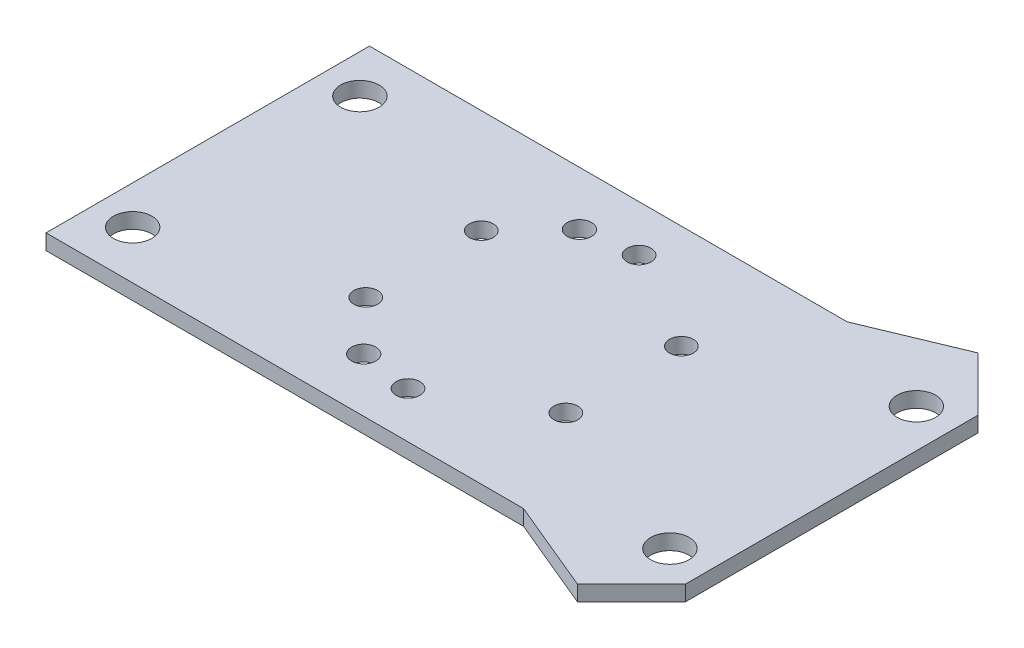
ISO-10303-21;
HEADER;
FILE_DESCRIPTION(('STEP AP214'),'2;1');
FILE_NAME('part.step','',(''),(''),'','','');
FILE_SCHEMA(('AUTOMOTIVE_DESIGN { 1 0 10303 214 1 1 1 1 }'));
ENDSEC;
DATA;
#1=APPLICATION_CONTEXT('core data for automotive mechanical design processes');
#2=APPLICATION_PROTOCOL_DEFINITION('international standard','automotive_design',2000,#1);
#3=PRODUCT_CONTEXT('',#1,'mechanical');
#4=PRODUCT('Part','Part','',(#3));
#5=PRODUCT_RELATED_PRODUCT_CATEGORY('part','',(#4));
#6=PRODUCT_DEFINITION_FORMATION('','',#4);
#7=PRODUCT_DEFINITION_CONTEXT('part definition',#1,'design');
#8=PRODUCT_DEFINITION('design','',#6,#7);
#9=PRODUCT_DEFINITION_SHAPE('','',#8);
#10=(LENGTH_UNIT() NAMED_UNIT(*) SI_UNIT(.MILLI.,.METRE.));
#11=(NAMED_UNIT(*) PLANE_ANGLE_UNIT() SI_UNIT($,.RADIAN.));
#12=(NAMED_UNIT(*) SI_UNIT($,.STERADIAN.) SOLID_ANGLE_UNIT());
#13=UNCERTAINTY_MEASURE_WITH_UNIT(LENGTH_MEASURE(1.E-05),#10,'distance_accuracy_value','');
#14=(GEOMETRIC_REPRESENTATION_CONTEXT(3) GLOBAL_UNCERTAINTY_ASSIGNED_CONTEXT((#13)) GLOBAL_UNIT_ASSIGNED_CONTEXT((#10,
#11,#12)) REPRESENTATION_CONTEXT('',''));
#15=CARTESIAN_POINT('',(0.,0.,0.));
#16=DIRECTION('',(0.,0.,1.));
#17=DIRECTION('',(1.,0.,0.));
#18=AXIS2_PLACEMENT_3D('',#15,#16,#17);
#19=CARTESIAN_POINT('',(0.,5.,-21.));
#20=DIRECTION('',(0.,0.,-1.));
#21=DIRECTION('',(-1.,0.,0.));
#22=AXIS2_PLACEMENT_3D('',#19,#20,#21);
#23=PLANE('',#22);
#24=DIRECTION('',(1.,0.,0.));
#25=VECTOR('',#24,1.);
#26=CARTESIAN_POINT('',(0.,0.,-21.));
#27=LINE('',#26,#25);
#28=CARTESIAN_POINT('',(-41.,0.,-21.));
#29=VERTEX_POINT('',#28);
#30=CARTESIAN_POINT('',(21.,0.,-21.));
#31=VERTEX_POINT('',#30);
#32=EDGE_CURVE('E11',#29,#31,#27,.T.);
#33=ORIENTED_EDGE('',*,*,#32,.T.);
#34=DIRECTION('',(0.,1.,0.));
#35=VECTOR('',#34,1.);
#36=CARTESIAN_POINT('',(21.,-2.,-21.));
#37=LINE('',#36,#35);
#38=CARTESIAN_POINT('',(21.,-2.,-21.));
#39=VERTEX_POINT('',#38);
#40=EDGE_CURVE('E136',#39,#31,#37,.T.);
#41=ORIENTED_EDGE('',*,*,#40,.F.);
#42=DIRECTION('',(1.,0.,0.));
#43=VECTOR('',#42,1.);
#44=CARTESIAN_POINT('',(0.,-2.,-21.));
#45=LINE('',#44,#43);
#46=CARTESIAN_POINT('',(-41.,-2.,-21.));
#47=VERTEX_POINT('',#46);
#48=EDGE_CURVE('E195',#47,#39,#45,.T.);
#49=ORIENTED_EDGE('',*,*,#48,.F.);
#50=DIRECTION('',(0.,1.,0.));
#51=VECTOR('',#50,1.);
#52=CARTESIAN_POINT('',(-41.,-2.,-21.));
#53=LINE('',#52,#51);
#54=EDGE_CURVE('E153',#47,#29,#53,.T.);
#55=ORIENTED_EDGE('',*,*,#54,.T.);
#56=EDGE_LOOP('',(#33,#41,#49,#55));
#57=FACE_BOUND('',#56,.T.);
#58=ADVANCED_FACE('F44',(#57),#23,.T.);
#59=CARTESIAN_POINT('',(0.,0.,21.));
#60=DIRECTION('',(0.,0.,1.));
#61=DIRECTION('',(1.,0.,0.));
#62=AXIS2_PLACEMENT_3D('',#59,#60,#61);
#63=PLANE('',#62);
#64=DIRECTION('',(0.,1.,0.));
#65=VECTOR('',#64,1.);
#66=CARTESIAN_POINT('',(21.,-2.,21.));
#67=LINE('',#66,#65);
#68=CARTESIAN_POINT('',(21.,-2.,21.));
#69=VERTEX_POINT('',#68);
#70=CARTESIAN_POINT('',(21.,0.,21.));
#71=VERTEX_POINT('',#70);
#72=EDGE_CURVE('E133',#69,#71,#67,.T.);
#73=ORIENTED_EDGE('',*,*,#72,.T.);
#74=DIRECTION('',(-1.,0.,0.));
#75=VECTOR('',#74,1.);
#76=CARTESIAN_POINT('',(0.,0.,21.));
#77=LINE('',#76,#75);
#78=CARTESIAN_POINT('',(-41.,0.,21.));
#79=VERTEX_POINT('',#78);
#80=EDGE_CURVE('E54',#71,#79,#77,.T.);
#81=ORIENTED_EDGE('',*,*,#80,.T.);
#82=DIRECTION('',(0.,1.,0.));
#83=VECTOR('',#82,1.);
#84=CARTESIAN_POINT('',(-41.,-2.,21.));
#85=LINE('',#84,#83);
#86=CARTESIAN_POINT('',(-41.,-2.,21.));
#87=VERTEX_POINT('',#86);
#88=EDGE_CURVE('E138',#87,#79,#85,.T.);
#89=ORIENTED_EDGE('',*,*,#88,.F.);
#90=DIRECTION('',(-1.,0.,0.));
#91=VECTOR('',#90,1.);
#92=CARTESIAN_POINT('',(0.,-2.,21.));
#93=LINE('',#92,#91);
#94=EDGE_CURVE('E160',#69,#87,#93,.T.);
#95=ORIENTED_EDGE('',*,*,#94,.F.);
#96=EDGE_LOOP('',(#73,#81,#89,#95));
#97=FACE_BOUND('',#96,.T.);
#98=ADVANCED_FACE('F46',(#97),#63,.T.);
#99=CARTESIAN_POINT('',(40.,5.,0.));
#100=DIRECTION('',(-1.,0.,0.));
#101=DIRECTION('',(0.,0.,1.));
#102=AXIS2_PLACEMENT_3D('',#99,#100,#101);
#103=PLANE('',#102);
#104=DIRECTION('',(0.,1.,0.));
#105=VECTOR('',#104,1.);
#106=CARTESIAN_POINT('',(40.,7.9,-19.));
#107=LINE('',#106,#105);
#108=CARTESIAN_POINT('',(40.,-2.,-19.));
#109=VERTEX_POINT('',#108);
#110=CARTESIAN_POINT('',(40.,0.,-19.));
#111=VERTEX_POINT('',#110);
#112=EDGE_CURVE('E48',#109,#111,#107,.T.);
#113=ORIENTED_EDGE('',*,*,#112,.T.);
#114=DIRECTION('',(0.,0.,1.));
#115=VECTOR('',#114,1.);
#116=CARTESIAN_POINT('',(40.,0.,0.));
#117=LINE('',#116,#115);
#118=CARTESIAN_POINT('',(40.,0.,19.));
#119=VERTEX_POINT('',#118);
#120=EDGE_CURVE('E127',#111,#119,#117,.T.);
#121=ORIENTED_EDGE('',*,*,#120,.T.);
#122=DIRECTION('',(0.,-1.,0.));
#123=VECTOR('',#122,1.);
#124=CARTESIAN_POINT('',(40.,5.,19.));
#125=LINE('',#124,#123);
#126=CARTESIAN_POINT('',(40.,-2.,19.));
#127=VERTEX_POINT('',#126);
#128=EDGE_CURVE('E126',#119,#127,#125,.T.);
#129=ORIENTED_EDGE('',*,*,#128,.T.);
#130=DIRECTION('',(0.,0.,1.));
#131=VECTOR('',#130,1.);
#132=CARTESIAN_POINT('',(40.,-2.,0.));
#133=LINE('',#132,#131);
#134=EDGE_CURVE('E203',#109,#127,#133,.T.);
#135=ORIENTED_EDGE('',*,*,#134,.F.);
#136=EDGE_LOOP('',(#113,#121,#129,#135));
#137=FACE_BOUND('',#136,.T.);
#138=ADVANCED_FACE('F207',(#137),#103,.F.);
#139=CARTESIAN_POINT('',(35.,5.,-16.));
#140=DIRECTION('',(0.,-1.,0.));
#141=DIRECTION('',(0.,0.,-1.));
#142=AXIS2_PLACEMENT_3D('',#139,#140,#141);
#143=CYLINDRICAL_SURFACE('',#142,2.5);
#144=CARTESIAN_POINT('',(35.,0.,-16.));
#145=DIRECTION('',(0.,-1.,0.));
#146=DIRECTION('',(0.,0.,-1.));
#147=AXIS2_PLACEMENT_3D('',#144,#145,#146);
#148=CIRCLE('',#147,2.5);
#149=CARTESIAN_POINT('',(35.,0.,-18.5));
#150=VERTEX_POINT('',#149);
#151=EDGE_CURVE('E167',#150,#150,#148,.T.);
#152=ORIENTED_EDGE('',*,*,#151,.F.);
#153=EDGE_LOOP('',(#152));
#154=FACE_BOUND('',#153,.T.);
#155=CARTESIAN_POINT('',(35.,-2.,-16.));
#156=DIRECTION('',(0.,-1.,0.));
#157=DIRECTION('',(0.,0.,-1.));
#158=AXIS2_PLACEMENT_3D('',#155,#156,#157);
#159=CIRCLE('',#158,2.5);
#160=CARTESIAN_POINT('',(35.,-2.,-18.5));
#161=VERTEX_POINT('',#160);
#162=EDGE_CURVE('E192',#161,#161,#159,.F.);
#163=ORIENTED_EDGE('',*,*,#162,.F.);
#164=EDGE_LOOP('',(#163));
#165=FACE_BOUND('',#164,.T.);
#166=ADVANCED_FACE('F209',(#154,#165),#143,.F.);
#167=CARTESIAN_POINT('',(-36.,5.,-14.75));
#168=DIRECTION('',(0.,-1.,0.));
#169=DIRECTION('',(0.,0.,-1.));
#170=AXIS2_PLACEMENT_3D('',#167,#168,#169);
#171=CYLINDRICAL_SURFACE('',#170,2.5);
#172=CARTESIAN_POINT('',(-36.,0.,-14.75));
#173=DIRECTION('',(0.,-1.,0.));
#174=DIRECTION('',(0.,0.,-1.));
#175=AXIS2_PLACEMENT_3D('',#172,#173,#174);
#176=CIRCLE('',#175,2.5);
#177=CARTESIAN_POINT('',(-36.,0.,-17.25));
#178=VERTEX_POINT('',#177);
#179=EDGE_CURVE('E170',#178,#178,#176,.T.);
#180=ORIENTED_EDGE('',*,*,#179,.F.);
#181=EDGE_LOOP('',(#180));
#182=FACE_BOUND('',#181,.T.);
#183=CARTESIAN_POINT('',(-36.,-2.,-14.75));
#184=DIRECTION('',(0.,-1.,0.));
#185=DIRECTION('',(0.,0.,-1.));
#186=AXIS2_PLACEMENT_3D('',#183,#184,#185);
#187=CIRCLE('',#186,2.5);
#188=CARTESIAN_POINT('',(-36.,-2.,-17.25));
#189=VERTEX_POINT('',#188);
#190=EDGE_CURVE('E180',#189,#189,#187,.F.);
#191=ORIENTED_EDGE('',*,*,#190,.F.);
#192=EDGE_LOOP('',(#191));
#193=FACE_BOUND('',#192,.T.);
#194=ADVANCED_FACE('F215',(#182,#193),#171,.F.);
#195=CARTESIAN_POINT('',(-36.,5.,14.75));
#196=DIRECTION('',(0.,-1.,0.));
#197=DIRECTION('',(0.,0.,-1.));
#198=AXIS2_PLACEMENT_3D('',#195,#196,#197);
#199=CYLINDRICAL_SURFACE('',#198,2.5);
#200=CARTESIAN_POINT('',(-36.,0.,14.75));
#201=DIRECTION('',(0.,-1.,0.));
#202=DIRECTION('',(0.,0.,-1.));
#203=AXIS2_PLACEMENT_3D('',#200,#201,#202);
#204=CIRCLE('',#203,2.5);
#205=CARTESIAN_POINT('',(-36.,0.,12.25));
#206=VERTEX_POINT('',#205);
#207=EDGE_CURVE('E174',#206,#206,#204,.T.);
#208=ORIENTED_EDGE('',*,*,#207,.F.);
#209=EDGE_LOOP('',(#208));
#210=FACE_BOUND('',#209,.T.);
#211=CARTESIAN_POINT('',(-36.,-2.,14.75));
#212=DIRECTION('',(0.,-1.,0.));
#213=DIRECTION('',(0.,0.,-1.));
#214=AXIS2_PLACEMENT_3D('',#211,#212,#213);
#215=CIRCLE('',#214,2.5);
#216=CARTESIAN_POINT('',(-36.,-2.,12.25));
#217=VERTEX_POINT('',#216);
#218=EDGE_CURVE('E189',#217,#217,#215,.F.);
#219=ORIENTED_EDGE('',*,*,#218,.F.);
#220=EDGE_LOOP('',(#219));
#221=FACE_BOUND('',#220,.T.);
#222=ADVANCED_FACE('F228',(#210,#221),#199,.F.);
#223=CARTESIAN_POINT('',(-41.,5.,0.));
#224=DIRECTION('',(-1.,0.,0.));
#225=DIRECTION('',(0.,0.,1.));
#226=AXIS2_PLACEMENT_3D('',#223,#224,#225);
#227=PLANE('',#226);
#228=DIRECTION('',(0.,0.,1.));
#229=VECTOR('',#228,1.);
#230=CARTESIAN_POINT('',(-41.,0.,0.));
#231=LINE('',#230,#229);
#232=EDGE_CURVE('E158',#29,#79,#231,.T.);
#233=ORIENTED_EDGE('',*,*,#232,.F.);
#234=ORIENTED_EDGE('',*,*,#54,.F.);
#235=DIRECTION('',(0.,0.,-1.));
#236=VECTOR('',#235,1.);
#237=CARTESIAN_POINT('',(-41.,-2.,0.));
#238=LINE('',#237,#236);
#239=EDGE_CURVE('E62',#87,#47,#238,.T.);
#240=ORIENTED_EDGE('',*,*,#239,.F.);
#241=ORIENTED_EDGE('',*,*,#88,.T.);
#242=EDGE_LOOP('',(#233,#234,#240,#241));
#243=FACE_BOUND('',#242,.T.);
#244=ADVANCED_FACE('F157',(#243),#227,.T.);
#245=CARTESIAN_POINT('',(35.,5.,16.));
#246=DIRECTION('',(0.,-1.,0.));
#247=DIRECTION('',(0.,0.,-1.));
#248=AXIS2_PLACEMENT_3D('',#245,#246,#247);
#249=CYLINDRICAL_SURFACE('',#248,2.5);
#250=CARTESIAN_POINT('',(35.,0.,16.));
#251=DIRECTION('',(0.,-1.,0.));
#252=DIRECTION('',(0.,0.,-1.));
#253=AXIS2_PLACEMENT_3D('',#250,#251,#252);
#254=CIRCLE('',#253,2.5);
#255=CARTESIAN_POINT('',(35.,0.,13.5));
#256=VERTEX_POINT('',#255);
#257=EDGE_CURVE('E324',#256,#256,#254,.T.);
#258=ORIENTED_EDGE('',*,*,#257,.F.);
#259=EDGE_LOOP('',(#258));
#260=FACE_BOUND('',#259,.T.);
#261=CARTESIAN_POINT('',(35.,-2.,16.));
#262=DIRECTION('',(0.,-1.,0.));
#263=DIRECTION('',(0.,0.,-1.));
#264=AXIS2_PLACEMENT_3D('',#261,#262,#263);
#265=CIRCLE('',#264,2.5);
#266=CARTESIAN_POINT('',(35.,-2.,13.5));
#267=VERTEX_POINT('',#266);
#268=EDGE_CURVE('E116',#267,#267,#265,.F.);
#269=ORIENTED_EDGE('',*,*,#268,.F.);
#270=EDGE_LOOP('',(#269));
#271=FACE_BOUND('',#270,.T.);
#272=ADVANCED_FACE('F227',(#260,#271),#249,.F.);
#273=CARTESIAN_POINT('',(-6.74999999999993,0.,14.));
#274=DIRECTION('',(0.,1.,0.));
#275=DIRECTION('',(0.,0.,1.));
#276=AXIS2_PLACEMENT_3D('',#273,#274,#275);
#277=CYLINDRICAL_SURFACE('',#276,1.57499999999999);
#278=CARTESIAN_POINT('',(-6.74999999999993,0.,14.));
#279=DIRECTION('',(0.,-1.,0.));
#280=DIRECTION('',(0.,0.,-1.));
#281=AXIS2_PLACEMENT_3D('',#278,#279,#280);
#282=CIRCLE('',#281,1.57499999999999);
#283=CARTESIAN_POINT('',(-6.74999999999993,0.,12.425));
#284=VERTEX_POINT('',#283);
#285=EDGE_CURVE('E332',#284,#284,#282,.T.);
#286=ORIENTED_EDGE('',*,*,#285,.F.);
#287=EDGE_LOOP('',(#286));
#288=FACE_BOUND('',#287,.T.);
#289=CARTESIAN_POINT('',(-6.74999999999993,-2.,14.));
#290=DIRECTION('',(0.,-1.,0.));
#291=DIRECTION('',(0.,0.,-1.));
#292=AXIS2_PLACEMENT_3D('',#289,#290,#291);
#293=CIRCLE('',#292,1.57499999999999);
#294=CARTESIAN_POINT('',(-6.74999999999993,-2.,12.425));
#295=VERTEX_POINT('',#294);
#296=EDGE_CURVE('E183',#295,#295,#293,.F.);
#297=ORIENTED_EDGE('',*,*,#296,.F.);
#298=EDGE_LOOP('',(#297));
#299=FACE_BOUND('',#298,.T.);
#300=ADVANCED_FACE('F237',(#288,#299),#277,.F.);
#301=CARTESIAN_POINT('',(-6.74999999999993,0.,-14.));
#302=DIRECTION('',(0.,1.,0.));
#303=DIRECTION('',(0.,0.,1.));
#304=AXIS2_PLACEMENT_3D('',#301,#302,#303);
#305=CYLINDRICAL_SURFACE('',#304,1.57499999999999);
#306=CARTESIAN_POINT('',(-6.74999999999993,0.,-14.));
#307=DIRECTION('',(0.,-1.,0.));
#308=DIRECTION('',(0.,0.,-1.));
#309=AXIS2_PLACEMENT_3D('',#306,#307,#308);
#310=CIRCLE('',#309,1.57499999999999);
#311=CARTESIAN_POINT('',(-6.74999999999993,0.,-15.575));
#312=VERTEX_POINT('',#311);
#313=EDGE_CURVE('E329',#312,#312,#310,.F.);
#314=ORIENTED_EDGE('',*,*,#313,.T.);
#315=EDGE_LOOP('',(#314));
#316=FACE_BOUND('',#315,.T.);
#317=CARTESIAN_POINT('',(-6.74999999999993,-2.,-14.));
#318=DIRECTION('',(0.,-1.,0.));
#319=DIRECTION('',(0.,0.,-1.));
#320=AXIS2_PLACEMENT_3D('',#317,#318,#319);
#321=CIRCLE('',#320,1.57499999999999);
#322=CARTESIAN_POINT('',(-6.74999999999993,-2.,-15.575));
#323=VERTEX_POINT('',#322);
#324=EDGE_CURVE('E186',#323,#323,#321,.F.);
#325=ORIENTED_EDGE('',*,*,#324,.F.);
#326=EDGE_LOOP('',(#325));
#327=FACE_BOUND('',#326,.T.);
#328=ADVANCED_FACE('F241',(#316,#327),#305,.F.);
#329=CARTESIAN_POINT('',(38.,5.,-21.));
#330=DIRECTION('',(0.707106781186547,0.,-0.707106781186547));
#331=DIRECTION('',(0.,1.,0.));
#332=AXIS2_PLACEMENT_3D('',#329,#330,#331);
#333=PLANE('',#332);
#334=DIRECTION('',(-0.707106781186548,0.,-0.707106781186548));
#335=VECTOR('',#334,1.);
#336=CARTESIAN_POINT('',(38.,0.,-21.));
#337=LINE('',#336,#335);
#338=CARTESIAN_POINT('',(33.,0.,-26.));
#339=VERTEX_POINT('',#338);
#340=EDGE_CURVE('E327',#111,#339,#337,.T.);
#341=ORIENTED_EDGE('',*,*,#340,.F.);
#342=ORIENTED_EDGE('',*,*,#112,.F.);
#343=DIRECTION('',(0.707106781186548,0.,0.707106781186548));
#344=VECTOR('',#343,1.);
#345=CARTESIAN_POINT('',(29.5,-2.,-29.5));
#346=LINE('',#345,#344);
#347=CARTESIAN_POINT('',(33.,-2.,-26.));
#348=VERTEX_POINT('',#347);
#349=EDGE_CURVE('E200',#348,#109,#346,.T.);
#350=ORIENTED_EDGE('',*,*,#349,.F.);
#351=DIRECTION('',(0.,1.,0.));
#352=VECTOR('',#351,1.);
#353=CARTESIAN_POINT('',(33.,-2.,-26.));
#354=LINE('',#353,#352);
#355=EDGE_CURVE('E132',#348,#339,#354,.T.);
#356=ORIENTED_EDGE('',*,*,#355,.T.);
#357=EDGE_LOOP('',(#341,#342,#350,#356));
#358=FACE_BOUND('',#357,.T.);
#359=ADVANCED_FACE('F245',(#358),#333,.T.);
#360=CARTESIAN_POINT('',(40.,5.,19.));
#361=DIRECTION('',(-0.707106781186549,0.,-0.707106781186546));
#362=DIRECTION('',(0.,-1.,0.));
#363=AXIS2_PLACEMENT_3D('',#360,#361,#362);
#364=PLANE('',#363);
#365=DIRECTION('',(-0.707106781186546,0.,0.707106781186549));
#366=VECTOR('',#365,1.);
#367=CARTESIAN_POINT('',(40.,0.,19.));
#368=LINE('',#367,#366);
#369=CARTESIAN_POINT('',(33.,0.,26.));
#370=VERTEX_POINT('',#369);
#371=EDGE_CURVE('E109',#370,#119,#368,.F.);
#372=ORIENTED_EDGE('',*,*,#371,.F.);
#373=DIRECTION('',(0.,1.,0.));
#374=VECTOR('',#373,1.);
#375=CARTESIAN_POINT('',(33.,-2.,26.));
#376=LINE('',#375,#374);
#377=CARTESIAN_POINT('',(33.,-2.,26.));
#378=VERTEX_POINT('',#377);
#379=EDGE_CURVE('E124',#378,#370,#376,.T.);
#380=ORIENTED_EDGE('',*,*,#379,.F.);
#381=DIRECTION('',(-0.707106781186546,0.,0.707106781186549));
#382=VECTOR('',#381,1.);
#383=CARTESIAN_POINT('',(29.5000000000001,-2.,29.5));
#384=LINE('',#383,#382);
#385=EDGE_CURVE('E163',#127,#378,#384,.T.);
#386=ORIENTED_EDGE('',*,*,#385,.F.);
#387=ORIENTED_EDGE('',*,*,#128,.F.);
#388=EDGE_LOOP('',(#372,#380,#386,#387));
#389=FACE_BOUND('',#388,.T.);
#390=ADVANCED_FACE('F122',(#389),#364,.F.);
#391=CARTESIAN_POINT('',(-4.3491124260355,-2.,-10.4378698224852));
#392=DIRECTION('',(-0.384615384615385,0.,-0.923076923076923));
#393=DIRECTION('',(-0.923076923076923,0.,0.384615384615385));
#394=AXIS2_PLACEMENT_3D('',#391,#392,#393);
#395=PLANE('',#394);
#396=DIRECTION('',(-0.923076923076923,0.,0.384615384615385));
#397=VECTOR('',#396,1.);
#398=CARTESIAN_POINT('',(-4.3491124260355,0.,-10.4378698224852));
#399=LINE('',#398,#397);
#400=EDGE_CURVE('E117',#339,#31,#399,.T.);
#401=ORIENTED_EDGE('',*,*,#400,.F.);
#402=ORIENTED_EDGE('',*,*,#355,.F.);
#403=DIRECTION('',(-0.923076923076923,0.,0.384615384615385));
#404=VECTOR('',#403,1.);
#405=CARTESIAN_POINT('',(-4.3491124260355,-2.,-10.4378698224852));
#406=LINE('',#405,#404);
#407=EDGE_CURVE('E197',#348,#39,#406,.T.);
#408=ORIENTED_EDGE('',*,*,#407,.T.);
#409=ORIENTED_EDGE('',*,*,#40,.T.);
#410=EDGE_LOOP('',(#401,#402,#408,#409));
#411=FACE_BOUND('',#410,.T.);
#412=ADVANCED_FACE('F247',(#411),#395,.T.);
#413=CARTESIAN_POINT('',(-4.34911242603551,-2.,10.4378698224852));
#414=DIRECTION('',(0.384615384615385,0.,-0.923076923076923));
#415=DIRECTION('',(-0.923076923076923,0.,-0.384615384615385));
#416=AXIS2_PLACEMENT_3D('',#413,#414,#415);
#417=PLANE('',#416);
#418=DIRECTION('',(-0.923076923076923,0.,-0.384615384615385));
#419=VECTOR('',#418,1.);
#420=CARTESIAN_POINT('',(-4.34911242603551,0.,10.4378698224852));
#421=LINE('',#420,#419);
#422=EDGE_CURVE('E105',#370,#71,#421,.T.);
#423=ORIENTED_EDGE('',*,*,#422,.T.);
#424=ORIENTED_EDGE('',*,*,#72,.F.);
#425=DIRECTION('',(-0.923076923076923,0.,-0.384615384615385));
#426=VECTOR('',#425,1.);
#427=CARTESIAN_POINT('',(-4.34911242603551,-2.,10.4378698224852));
#428=LINE('',#427,#426);
#429=EDGE_CURVE('E131',#378,#69,#428,.T.);
#430=ORIENTED_EDGE('',*,*,#429,.F.);
#431=ORIENTED_EDGE('',*,*,#379,.T.);
#432=EDGE_LOOP('',(#423,#424,#430,#431));
#433=FACE_BOUND('',#432,.T.);
#434=ADVANCED_FACE('F130',(#433),#417,.F.);
#435=CARTESIAN_POINT('',(0.,-2.,0.));
#436=DIRECTION('',(0.,-1.,0.));
#437=DIRECTION('',(0.,0.,-1.));
#438=AXIS2_PLACEMENT_3D('',#435,#436,#437);
#439=PLANE('',#438);
#440=CARTESIAN_POINT('',(0.,-2.,15.));
#441=DIRECTION('',(0.,-1.,0.));
#442=DIRECTION('',(0.,0.,-1.));
#443=AXIS2_PLACEMENT_3D('',#440,#441,#442);
#444=CIRCLE('',#443,1.55);
#445=CARTESIAN_POINT('',(0.,-2.,13.45));
#446=VERTEX_POINT('',#445);
#447=EDGE_CURVE('E128',#446,#446,#444,.F.);
#448=ORIENTED_EDGE('',*,*,#447,.T.);
#449=EDGE_LOOP('',(#448));
#450=FACE_BOUND('',#449,.T.);
#451=CARTESIAN_POINT('',(-12.9903810567666,-2.,7.49999999999998));
#452=DIRECTION('',(0.,-1.,0.));
#453=DIRECTION('',(0.,0.,-1.));
#454=AXIS2_PLACEMENT_3D('',#451,#452,#453);
#455=CIRCLE('',#454,1.55);
#456=CARTESIAN_POINT('',(-12.9903810567666,-2.,5.94999999999997));
#457=VERTEX_POINT('',#456);
#458=EDGE_CURVE('E319',#457,#457,#455,.F.);
#459=ORIENTED_EDGE('',*,*,#458,.T.);
#460=EDGE_LOOP('',(#459));
#461=FACE_BOUND('',#460,.T.);
#462=CARTESIAN_POINT('',(-12.9903810567666,-2.,-7.50000000000002));
#463=DIRECTION('',(0.,-1.,0.));
#464=DIRECTION('',(0.,0.,-1.));
#465=AXIS2_PLACEMENT_3D('',#462,#463,#464);
#466=CIRCLE('',#465,1.55);
#467=CARTESIAN_POINT('',(-12.9903810567666,-2.,-9.05000000000002));
#468=VERTEX_POINT('',#467);
#469=EDGE_CURVE('E316',#468,#468,#466,.F.);
#470=ORIENTED_EDGE('',*,*,#469,.T.);
#471=EDGE_LOOP('',(#470));
#472=FACE_BOUND('',#471,.T.);
#473=CARTESIAN_POINT('',(0.,-2.,-15.));
#474=DIRECTION('',(0.,-1.,0.));
#475=DIRECTION('',(0.,0.,-1.));
#476=AXIS2_PLACEMENT_3D('',#473,#474,#475);
#477=CIRCLE('',#476,1.55);
#478=CARTESIAN_POINT('',(0.,-2.,-16.55));
#479=VERTEX_POINT('',#478);
#480=EDGE_CURVE('E313',#479,#479,#477,.F.);
#481=ORIENTED_EDGE('',*,*,#480,.T.);
#482=EDGE_LOOP('',(#481));
#483=FACE_BOUND('',#482,.T.);
#484=CARTESIAN_POINT('',(12.9903810567666,-2.,-7.49999999999999));
#485=DIRECTION('',(0.,-1.,0.));
#486=DIRECTION('',(0.,0.,-1.));
#487=AXIS2_PLACEMENT_3D('',#484,#485,#486);
#488=CIRCLE('',#487,1.55);
#489=CARTESIAN_POINT('',(12.9903810567666,-2.,-9.04999999999999));
#490=VERTEX_POINT('',#489);
#491=EDGE_CURVE('E287',#490,#490,#488,.F.);
#492=ORIENTED_EDGE('',*,*,#491,.T.);
#493=EDGE_LOOP('',(#492));
#494=FACE_BOUND('',#493,.T.);
#495=CARTESIAN_POINT('',(12.9903810567666,-2.,7.50000000000001));
#496=DIRECTION('',(0.,-1.,0.));
#497=DIRECTION('',(0.,0.,-1.));
#498=AXIS2_PLACEMENT_3D('',#495,#496,#497);
#499=CIRCLE('',#498,1.55);
#500=CARTESIAN_POINT('',(12.9903810567666,-2.,5.95000000000001));
#501=VERTEX_POINT('',#500);
#502=EDGE_CURVE('E296',#501,#501,#499,.F.);
#503=ORIENTED_EDGE('',*,*,#502,.T.);
#504=EDGE_LOOP('',(#503));
#505=FACE_BOUND('',#504,.T.);
#506=ORIENTED_EDGE('',*,*,#268,.T.);
#507=EDGE_LOOP('',(#506));
#508=FACE_BOUND('',#507,.T.);
#509=ORIENTED_EDGE('',*,*,#190,.T.);
#510=EDGE_LOOP('',(#509));
#511=FACE_BOUND('',#510,.T.);
#512=ORIENTED_EDGE('',*,*,#296,.T.);
#513=EDGE_LOOP('',(#512));
#514=FACE_BOUND('',#513,.T.);
#515=ORIENTED_EDGE('',*,*,#324,.T.);
#516=EDGE_LOOP('',(#515));
#517=FACE_BOUND('',#516,.T.);
#518=ORIENTED_EDGE('',*,*,#218,.T.);
#519=EDGE_LOOP('',(#518));
#520=FACE_BOUND('',#519,.T.);
#521=ORIENTED_EDGE('',*,*,#162,.T.);
#522=EDGE_LOOP('',(#521));
#523=FACE_BOUND('',#522,.T.);
#524=ORIENTED_EDGE('',*,*,#48,.T.);
#525=ORIENTED_EDGE('',*,*,#407,.F.);
#526=ORIENTED_EDGE('',*,*,#349,.T.);
#527=ORIENTED_EDGE('',*,*,#134,.T.);
#528=ORIENTED_EDGE('',*,*,#385,.T.);
#529=ORIENTED_EDGE('',*,*,#429,.T.);
#530=ORIENTED_EDGE('',*,*,#94,.T.);
#531=ORIENTED_EDGE('',*,*,#239,.T.);
#532=EDGE_LOOP('',(#524,#525,#526,#527,#528,#529,#530,#531));
#533=FACE_BOUND('',#532,.T.);
#534=ADVANCED_FACE('F204',(#450,#461,#472,#483,#494,#505,#508,#511,#514,#517,#520,#523,#533),
#439,.T.);
#535=CARTESIAN_POINT('',(0.,0.,0.));
#536=DIRECTION('',(0.,-1.,0.));
#537=DIRECTION('',(0.,0.,-1.));
#538=AXIS2_PLACEMENT_3D('',#535,#536,#537);
#539=PLANE('',#538);
#540=CARTESIAN_POINT('',(0.,0.,15.));
#541=DIRECTION('',(0.,-1.,0.));
#542=DIRECTION('',(0.,0.,-1.));
#543=AXIS2_PLACEMENT_3D('',#540,#541,#542);
#544=CIRCLE('',#543,1.55);
#545=CARTESIAN_POINT('',(0.,0.,13.45));
#546=VERTEX_POINT('',#545);
#547=EDGE_CURVE('E307',#546,#546,#544,.T.);
#548=ORIENTED_EDGE('',*,*,#547,.T.);
#549=EDGE_LOOP('',(#548));
#550=FACE_BOUND('',#549,.T.);
#551=CARTESIAN_POINT('',(-12.9903810567666,0.,7.49999999999998));
#552=DIRECTION('',(0.,-1.,0.));
#553=DIRECTION('',(0.,0.,-1.));
#554=AXIS2_PLACEMENT_3D('',#551,#552,#553);
#555=CIRCLE('',#554,1.55);
#556=CARTESIAN_POINT('',(-12.9903810567666,0.,5.94999999999997));
#557=VERTEX_POINT('',#556);
#558=EDGE_CURVE('E304',#557,#557,#555,.T.);
#559=ORIENTED_EDGE('',*,*,#558,.T.);
#560=EDGE_LOOP('',(#559));
#561=FACE_BOUND('',#560,.T.);
#562=CARTESIAN_POINT('',(-12.9903810567666,0.,-7.50000000000002));
#563=DIRECTION('',(0.,-1.,0.));
#564=DIRECTION('',(0.,0.,-1.));
#565=AXIS2_PLACEMENT_3D('',#562,#563,#564);
#566=CIRCLE('',#565,1.55);
#567=CARTESIAN_POINT('',(-12.9903810567666,0.,-9.05000000000002));
#568=VERTEX_POINT('',#567);
#569=EDGE_CURVE('E299',#568,#568,#566,.T.);
#570=ORIENTED_EDGE('',*,*,#569,.T.);
#571=EDGE_LOOP('',(#570));
#572=FACE_BOUND('',#571,.T.);
#573=CARTESIAN_POINT('',(0.,0.,-15.));
#574=DIRECTION('',(0.,-1.,0.));
#575=DIRECTION('',(0.,0.,-1.));
#576=AXIS2_PLACEMENT_3D('',#573,#574,#575);
#577=CIRCLE('',#576,1.55);
#578=CARTESIAN_POINT('',(0.,0.,-16.55));
#579=VERTEX_POINT('',#578);
#580=EDGE_CURVE('E293',#579,#579,#577,.T.);
#581=ORIENTED_EDGE('',*,*,#580,.T.);
#582=EDGE_LOOP('',(#581));
#583=FACE_BOUND('',#582,.T.);
#584=CARTESIAN_POINT('',(12.9903810567666,0.,-7.49999999999999));
#585=DIRECTION('',(0.,-1.,0.));
#586=DIRECTION('',(0.,0.,-1.));
#587=AXIS2_PLACEMENT_3D('',#584,#585,#586);
#588=CIRCLE('',#587,1.55);
#589=CARTESIAN_POINT('',(12.9903810567666,0.,-9.04999999999999));
#590=VERTEX_POINT('',#589);
#591=EDGE_CURVE('E290',#590,#590,#588,.T.);
#592=ORIENTED_EDGE('',*,*,#591,.T.);
#593=EDGE_LOOP('',(#592));
#594=FACE_BOUND('',#593,.T.);
#595=CARTESIAN_POINT('',(12.9903810567666,0.,7.50000000000001));
#596=DIRECTION('',(0.,-1.,0.));
#597=DIRECTION('',(0.,0.,-1.));
#598=AXIS2_PLACEMENT_3D('',#595,#596,#597);
#599=CIRCLE('',#598,1.55);
#600=CARTESIAN_POINT('',(12.9903810567666,0.,5.95000000000001));
#601=VERTEX_POINT('',#600);
#602=EDGE_CURVE('E292',#601,#601,#599,.T.);
#603=ORIENTED_EDGE('',*,*,#602,.T.);
#604=EDGE_LOOP('',(#603));
#605=FACE_BOUND('',#604,.T.);
#606=ORIENTED_EDGE('',*,*,#32,.F.);
#607=ORIENTED_EDGE('',*,*,#232,.T.);
#608=ORIENTED_EDGE('',*,*,#80,.F.);
#609=ORIENTED_EDGE('',*,*,#422,.F.);
#610=ORIENTED_EDGE('',*,*,#371,.T.);
#611=ORIENTED_EDGE('',*,*,#120,.F.);
#612=ORIENTED_EDGE('',*,*,#340,.T.);
#613=ORIENTED_EDGE('',*,*,#400,.T.);
#614=EDGE_LOOP('',(#606,#607,#608,#609,#610,#611,#612,#613));
#615=FACE_BOUND('',#614,.T.);
#616=ORIENTED_EDGE('',*,*,#151,.T.);
#617=EDGE_LOOP('',(#616));
#618=FACE_BOUND('',#617,.T.);
#619=ORIENTED_EDGE('',*,*,#179,.T.);
#620=EDGE_LOOP('',(#619));
#621=FACE_BOUND('',#620,.T.);
#622=ORIENTED_EDGE('',*,*,#207,.T.);
#623=EDGE_LOOP('',(#622));
#624=FACE_BOUND('',#623,.T.);
#625=ORIENTED_EDGE('',*,*,#257,.T.);
#626=EDGE_LOOP('',(#625));
#627=FACE_BOUND('',#626,.T.);
#628=ORIENTED_EDGE('',*,*,#285,.T.);
#629=EDGE_LOOP('',(#628));
#630=FACE_BOUND('',#629,.T.);
#631=ORIENTED_EDGE('',*,*,#313,.F.);
#632=EDGE_LOOP('',(#631));
#633=FACE_BOUND('',#632,.T.);
#634=ADVANCED_FACE('F107',(#550,#561,#572,#583,#594,#605,#615,#618,#621,#624,#627,#630,#633),
#539,.F.);
#635=CARTESIAN_POINT('',(12.9903810567666,-10.,7.50000000000001));
#636=DIRECTION('',(0.,1.,0.));
#637=DIRECTION('',(0.,0.,1.));
#638=AXIS2_PLACEMENT_3D('',#635,#636,#637);
#639=CYLINDRICAL_SURFACE('',#638,1.55);
#640=ORIENTED_EDGE('',*,*,#502,.F.);
#641=EDGE_LOOP('',(#640));
#642=FACE_BOUND('',#641,.T.);
#643=ORIENTED_EDGE('',*,*,#602,.F.);
#644=EDGE_LOOP('',(#643));
#645=FACE_BOUND('',#644,.T.);
#646=ADVANCED_FACE('F258',(#642,#645),#639,.F.);
#647=CARTESIAN_POINT('',(12.9903810567666,-10.,-7.49999999999999));
#648=DIRECTION('',(0.,1.,0.));
#649=DIRECTION('',(0.,0.,1.));
#650=AXIS2_PLACEMENT_3D('',#647,#648,#649);
#651=CYLINDRICAL_SURFACE('',#650,1.55);
#652=ORIENTED_EDGE('',*,*,#491,.F.);
#653=EDGE_LOOP('',(#652));
#654=FACE_BOUND('',#653,.T.);
#655=ORIENTED_EDGE('',*,*,#591,.F.);
#656=EDGE_LOOP('',(#655));
#657=FACE_BOUND('',#656,.T.);
#658=ADVANCED_FACE('F262',(#654,#657),#651,.F.);
#659=CARTESIAN_POINT('',(0.,-10.,-15.));
#660=DIRECTION('',(0.,1.,0.));
#661=DIRECTION('',(0.,0.,1.));
#662=AXIS2_PLACEMENT_3D('',#659,#660,#661);
#663=CYLINDRICAL_SURFACE('',#662,1.55);
#664=ORIENTED_EDGE('',*,*,#480,.F.);
#665=EDGE_LOOP('',(#664));
#666=FACE_BOUND('',#665,.T.);
#667=ORIENTED_EDGE('',*,*,#580,.F.);
#668=EDGE_LOOP('',(#667));
#669=FACE_BOUND('',#668,.T.);
#670=ADVANCED_FACE('F275',(#666,#669),#663,.F.);
#671=CARTESIAN_POINT('',(-12.9903810567666,-10.,-7.50000000000002));
#672=DIRECTION('',(0.,1.,0.));
#673=DIRECTION('',(0.,0.,1.));
#674=AXIS2_PLACEMENT_3D('',#671,#672,#673);
#675=CYLINDRICAL_SURFACE('',#674,1.55);
#676=ORIENTED_EDGE('',*,*,#469,.F.);
#677=EDGE_LOOP('',(#676));
#678=FACE_BOUND('',#677,.T.);
#679=ORIENTED_EDGE('',*,*,#569,.F.);
#680=EDGE_LOOP('',(#679));
#681=FACE_BOUND('',#680,.T.);
#682=ADVANCED_FACE('F271',(#678,#681),#675,.F.);
#683=CARTESIAN_POINT('',(-12.9903810567666,-10.,7.49999999999998));
#684=DIRECTION('',(0.,1.,0.));
#685=DIRECTION('',(0.,0.,1.));
#686=AXIS2_PLACEMENT_3D('',#683,#684,#685);
#687=CYLINDRICAL_SURFACE('',#686,1.55);
#688=ORIENTED_EDGE('',*,*,#458,.F.);
#689=EDGE_LOOP('',(#688));
#690=FACE_BOUND('',#689,.T.);
#691=ORIENTED_EDGE('',*,*,#558,.F.);
#692=EDGE_LOOP('',(#691));
#693=FACE_BOUND('',#692,.T.);
#694=ADVANCED_FACE('F267',(#690,#693),#687,.F.);
#695=CARTESIAN_POINT('',(0.,-10.,15.));
#696=DIRECTION('',(0.,1.,0.));
#697=DIRECTION('',(0.,0.,1.));
#698=AXIS2_PLACEMENT_3D('',#695,#696,#697);
#699=CYLINDRICAL_SURFACE('',#698,1.55);
#700=ORIENTED_EDGE('',*,*,#447,.F.);
#701=EDGE_LOOP('',(#700));
#702=FACE_BOUND('',#701,.T.);
#703=ORIENTED_EDGE('',*,*,#547,.F.);
#704=EDGE_LOOP('',(#703));
#705=FACE_BOUND('',#704,.T.);
#706=ADVANCED_FACE('F264',(#702,#705),#699,.F.);
#707=CLOSED_SHELL('',(#58,#98,#138,#166,#194,#222,#244,#272,#300,#328,#359,#390,#412,#434,#534,
#634,#646,#658,#670,#682,#694,#706));
#708=MANIFOLD_SOLID_BREP('B2',#707);
#709=ADVANCED_BREP_SHAPE_REPRESENTATION('',(#18,#708),#14);
#710=SHAPE_DEFINITION_REPRESENTATION(#9,#709);
ENDSEC;
END-ISO-10303-21;
